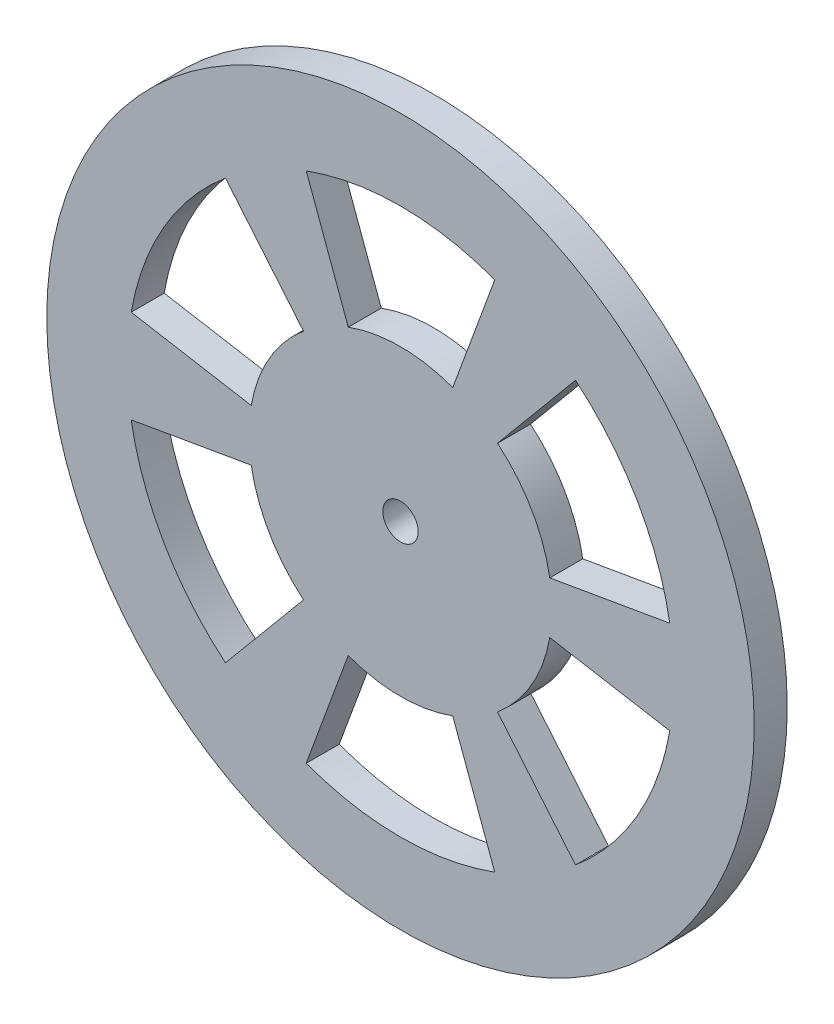
ISO-10303-21;
HEADER;
FILE_DESCRIPTION(('STEP AP214'),'2;1');
FILE_NAME('part.step','',(''),(''),'','','');
FILE_SCHEMA(('AUTOMOTIVE_DESIGN { 1 0 10303 214 1 1 1 1 }'));
ENDSEC;
DATA;
#1=APPLICATION_CONTEXT('core data for automotive mechanical design processes');
#2=APPLICATION_PROTOCOL_DEFINITION('international standard','automotive_design',2000,#1);
#3=PRODUCT_CONTEXT('',#1,'mechanical');
#4=PRODUCT('Part','Part','',(#3));
#5=PRODUCT_RELATED_PRODUCT_CATEGORY('part','',(#4));
#6=PRODUCT_DEFINITION_FORMATION('','',#4);
#7=PRODUCT_DEFINITION_CONTEXT('part definition',#1,'design');
#8=PRODUCT_DEFINITION('design','',#6,#7);
#9=PRODUCT_DEFINITION_SHAPE('','',#8);
#10=(LENGTH_UNIT() NAMED_UNIT(*) SI_UNIT(.MILLI.,.METRE.));
#11=(NAMED_UNIT(*) PLANE_ANGLE_UNIT() SI_UNIT($,.RADIAN.));
#12=(NAMED_UNIT(*) SI_UNIT($,.STERADIAN.) SOLID_ANGLE_UNIT());
#13=UNCERTAINTY_MEASURE_WITH_UNIT(LENGTH_MEASURE(1.E-05),#10,'distance_accuracy_value','');
#14=(GEOMETRIC_REPRESENTATION_CONTEXT(3) GLOBAL_UNCERTAINTY_ASSIGNED_CONTEXT((#13)) GLOBAL_UNIT_ASSIGNED_CONTEXT((#10,
#11,#12)) REPRESENTATION_CONTEXT('',''));
#15=CARTESIAN_POINT('',(0.,0.,0.));
#16=DIRECTION('',(0.,0.,1.));
#17=DIRECTION('',(1.,0.,0.));
#18=AXIS2_PLACEMENT_3D('',#15,#16,#17);
#19=CARTESIAN_POINT('',(183.021792722612,1.63874984873974,2.8));
#20=DIRECTION('',(0.,0.,1.));
#21=DIRECTION('',(1.,0.,0.));
#22=AXIS2_PLACEMENT_3D('',#19,#20,#21);
#23=PLANE('',#22);
#24=CARTESIAN_POINT('',(183.021792722612,1.63874984873974,2.8));
#25=DIRECTION('',(0.,0.,1.));
#26=DIRECTION('',(1.,0.,0.));
#27=AXIS2_PLACEMENT_3D('',#24,#25,#26);
#28=CIRCLE('',#27,30.);
#29=CARTESIAN_POINT('',(213.021792722612,1.63874984873974,2.8));
#30=VERTEX_POINT('',#29);
#31=EDGE_CURVE('E11',#30,#30,#28,.T.);
#32=ORIENTED_EDGE('',*,*,#31,.T.);
#33=EDGE_LOOP('',(#32));
#34=FACE_BOUND('',#33,.T.);
#35=CARTESIAN_POINT('',(183.021792722612,1.63874984873974,2.8));
#36=DIRECTION('',(0.,0.,1.));
#37=DIRECTION('',(1.,0.,0.));
#38=AXIS2_PLACEMENT_3D('',#35,#36,#37);
#39=CIRCLE('',#38,1.5);
#40=CARTESIAN_POINT('',(184.521792722612,1.63874984873974,2.8));
#41=VERTEX_POINT('',#40);
#42=EDGE_CURVE('E464',#41,#41,#39,.T.);
#43=ORIENTED_EDGE('',*,*,#42,.F.);
#44=EDGE_LOOP('',(#43));
#45=FACE_BOUND('',#44,.T.);
#46=DIRECTION('',(-0.985365515869282,-0.170454686458493,0.));
#47=VECTOR('',#46,1.);
#48=CARTESIAN_POINT('',(160.183368766663,-2.31198349023178,2.8));
#49=LINE('',#48,#47);
#50=CARTESIAN_POINT('',(170.361444544406,-0.551316319009075,2.8));
#51=VERTEX_POINT('',#50);
#52=CARTESIAN_POINT('',(160.183368766663,-2.31198349023178,2.8));
#53=VERTEX_POINT('',#52);
#54=EDGE_CURVE('E424',#51,#53,#49,.T.);
#55=ORIENTED_EDGE('',*,*,#54,.F.);
#56=CARTESIAN_POINT('',(183.021792722612,1.63874984873974,2.8));
#57=DIRECTION('',(0.,0.,-1.));
#58=DIRECTION('',(1.,0.,0.));
#59=AXIS2_PLACEMENT_3D('',#56,#57,#58);
#60=CIRCLE('',#59,12.8483775556502);
#61=CARTESIAN_POINT('',(174.792614703204,-8.22843997093123,2.8));
#62=VERTEX_POINT('',#61);
#63=EDGE_CURVE('E421',#62,#51,#60,.T.);
#64=ORIENTED_EDGE('',*,*,#63,.F.);
#65=DIRECTION('',(0.640483826363731,0.767971658439603,0.));
#66=VECTOR('',#65,1.);
#67=CARTESIAN_POINT('',(168.176904274776,-16.1610026686035,2.8));
#68=LINE('',#67,#66);
#69=CARTESIAN_POINT('',(168.176904274776,-16.1610026686035,2.8));
#70=VERTEX_POINT('',#69);
#71=EDGE_CURVE('E432',#70,#62,#68,.T.);
#72=ORIENTED_EDGE('',*,*,#71,.F.);
#73=CARTESIAN_POINT('',(183.021792722612,1.63874984873974,2.8));
#74=DIRECTION('',(0.,0.,1.));
#75=DIRECTION('',(1.,0.,0.));
#76=AXIS2_PLACEMENT_3D('',#73,#74,#75);
#77=CIRCLE('',#76,23.1776164155711);
#78=EDGE_CURVE('E428',#53,#70,#77,.T.);
#79=ORIENTED_EDGE('',*,*,#78,.F.);
#80=EDGE_LOOP('',(#55,#64,#72,#79));
#81=FACE_BOUND('',#80,.T.);
#82=DIRECTION('',(-0.345064669267472,-0.938578911985204,0.));
#83=VECTOR('',#82,1.);
#84=CARTESIAN_POINT('',(175.024016179765,-20.1152721489974,2.8));
#85=LINE('',#84,#83);
#86=CARTESIAN_POINT('',(178.588271570748,-10.4204663782176,2.8));
#87=VERTEX_POINT('',#86);
#88=CARTESIAN_POINT('',(175.024016179765,-20.1152721489974,2.8));
#89=VERTEX_POINT('',#88);
#90=EDGE_CURVE('E381',#87,#89,#85,.T.);
#91=ORIENTED_EDGE('',*,*,#90,.F.);
#92=CARTESIAN_POINT('',(183.021792722612,1.63874984873974,2.8));
#93=DIRECTION('',(0.,0.,-1.));
#94=DIRECTION('',(1.,0.,0.));
#95=AXIS2_PLACEMENT_3D('',#92,#93,#94);
#96=CIRCLE('',#95,12.8483775556503);
#97=CARTESIAN_POINT('',(187.452440760706,-10.4215222781683,2.8));
#98=VERTEX_POINT('',#97);
#99=EDGE_CURVE('E378',#98,#87,#96,.T.);
#100=ORIENTED_EDGE('',*,*,#99,.F.);
#101=DIRECTION('',(-0.344841052413296,0.938661093563854,0.));
#102=VECTOR('',#101,1.);
#103=CARTESIAN_POINT('',(191.01438635979,-20.1171769221038,2.8));
#104=LINE('',#103,#102);
#105=CARTESIAN_POINT('',(191.01438635979,-20.1171769221038,2.8));
#106=VERTEX_POINT('',#105);
#107=EDGE_CURVE('E389',#106,#98,#104,.T.);
#108=ORIENTED_EDGE('',*,*,#107,.F.);
#109=CARTESIAN_POINT('',(183.021792722612,1.63874984873974,2.8));
#110=DIRECTION('',(0.,0.,1.));
#111=DIRECTION('',(1.,0.,0.));
#112=AXIS2_PLACEMENT_3D('',#109,#110,#111);
#113=CIRCLE('',#112,23.1776164155711);
#114=EDGE_CURVE('E385',#89,#106,#113,.T.);
#115=ORIENTED_EDGE('',*,*,#114,.F.);
#116=EDGE_LOOP('',(#91,#100,#108,#115));
#117=FACE_BOUND('',#116,.T.);
#118=DIRECTION('',(0.985324878777029,-0.170689435124245,0.));
#119=VECTOR('',#118,1.);
#120=CARTESIAN_POINT('',(160.184310637599,5.59492410224006,2.8));
#121=LINE('',#120,#119);
#122=CARTESIAN_POINT('',(160.184310637599,5.59492410224006,2.8));
#123=VERTEX_POINT('',#122);
#124=CARTESIAN_POINT('',(170.36196666511,3.83183215597675,2.8));
#125=VERTEX_POINT('',#124);
#126=EDGE_CURVE('E338',#123,#125,#121,.T.);
#127=ORIENTED_EDGE('',*,*,#126,.F.);
#128=CARTESIAN_POINT('',(183.021792722612,1.63874984873974,2.8));
#129=DIRECTION('',(0.,0.,1.));
#130=DIRECTION('',(1.,0.,0.));
#131=AXIS2_PLACEMENT_3D('',#128,#129,#130);
#132=CIRCLE('',#131,23.1776164155711);
#133=CARTESIAN_POINT('',(168.18114530951,19.4420385075054,2.8));
#134=VERTEX_POINT('',#133);
#135=EDGE_CURVE('E335',#134,#123,#132,.T.);
#136=ORIENTED_EDGE('',*,*,#135,.F.);
#137=DIRECTION('',(-0.640300846601809,0.768124225526709,0.));
#138=VECTOR('',#137,1.);
#139=CARTESIAN_POINT('',(168.18114530951,19.4420385075054,2.8));
#140=LINE('',#139,#138);
#141=CARTESIAN_POINT('',(174.79496569627,11.5078999079482,2.8));
#142=VERTEX_POINT('',#141);
#143=EDGE_CURVE('E346',#142,#134,#140,.T.);
#144=ORIENTED_EDGE('',*,*,#143,.F.);
#145=CARTESIAN_POINT('',(183.021792722612,1.63874984873974,2.8));
#146=DIRECTION('',(0.,0.,-1.));
#147=DIRECTION('',(1.,0.,0.));
#148=AXIS2_PLACEMENT_3D('',#145,#146,#147);
#149=CIRCLE('',#148,12.8483775556502);
#150=EDGE_CURVE('E342',#125,#142,#149,.T.);
#151=ORIENTED_EDGE('',*,*,#150,.F.);
#152=EDGE_LOOP('',(#127,#136,#144,#151));
#153=FACE_BOUND('',#152,.T.);
#154=DIRECTION('',(0.640300846601808,-0.76812422552671,0.));
#155=VECTOR('',#154,1.);
#156=CARTESIAN_POINT('',(197.862440135714,-16.1645388100259,2.8));
#157=LINE('',#156,#155);
#158=CARTESIAN_POINT('',(191.248619748955,-8.23040021046873,2.8));
#159=VERTEX_POINT('',#158);
#160=CARTESIAN_POINT('',(197.862440135714,-16.1645388100259,2.8));
#161=VERTEX_POINT('',#160);
#162=EDGE_CURVE('E295',#159,#161,#157,.T.);
#163=ORIENTED_EDGE('',*,*,#162,.F.);
#164=CARTESIAN_POINT('',(183.021792722612,1.63874984873974,2.8));
#165=DIRECTION('',(0.,0.,-1.));
#166=DIRECTION('',(1.,0.,0.));
#167=AXIS2_PLACEMENT_3D('',#164,#165,#166);
#168=CIRCLE('',#167,12.8483775556502);
#169=CARTESIAN_POINT('',(195.681618780115,-0.554332458497256,2.8));
#170=VERTEX_POINT('',#169);
#171=EDGE_CURVE('E292',#170,#159,#168,.T.);
#172=ORIENTED_EDGE('',*,*,#171,.F.);
#173=DIRECTION('',(-0.985324878777028,0.170689435124247,0.));
#174=VECTOR('',#173,1.);
#175=CARTESIAN_POINT('',(205.859274807625,-2.31742440476058,2.8));
#176=LINE('',#175,#174);
#177=CARTESIAN_POINT('',(205.859274807625,-2.31742440476059,2.8));
#178=VERTEX_POINT('',#177);
#179=EDGE_CURVE('E303',#178,#170,#176,.T.);
#180=ORIENTED_EDGE('',*,*,#179,.F.);
#181=CARTESIAN_POINT('',(183.021792722612,1.63874984873974,2.8));
#182=DIRECTION('',(0.,0.,1.));
#183=DIRECTION('',(1.,0.,0.));
#184=AXIS2_PLACEMENT_3D('',#181,#182,#183);
#185=CIRCLE('',#184,23.1776164155711);
#186=EDGE_CURVE('E299',#161,#178,#185,.T.);
#187=ORIENTED_EDGE('',*,*,#186,.F.);
#188=EDGE_LOOP('',(#163,#172,#180,#187));
#189=FACE_BOUND('',#188,.T.);
#190=DIRECTION('',(-0.640483826363731,-0.767971658439603,0.));
#191=VECTOR('',#190,1.);
#192=CARTESIAN_POINT('',(197.866681170448,19.4385023660829,2.8));
#193=LINE('',#192,#191);
#194=CARTESIAN_POINT('',(197.866681170448,19.4385023660829,2.8));
#195=VERTEX_POINT('',#194);
#196=CARTESIAN_POINT('',(191.250970742021,11.5059396684107,2.8));
#197=VERTEX_POINT('',#196);
#198=EDGE_CURVE('E252',#195,#197,#193,.T.);
#199=ORIENTED_EDGE('',*,*,#198,.F.);
#200=CARTESIAN_POINT('',(183.021792722612,1.63874984873974,2.8));
#201=DIRECTION('',(0.,0.,1.));
#202=DIRECTION('',(1.,0.,0.));
#203=AXIS2_PLACEMENT_3D('',#200,#201,#202);
#204=CIRCLE('',#203,23.1776164155711);
#205=CARTESIAN_POINT('',(205.860216678562,5.58948318771124,2.8));
#206=VERTEX_POINT('',#205);
#207=EDGE_CURVE('E249',#206,#195,#204,.T.);
#208=ORIENTED_EDGE('',*,*,#207,.F.);
#209=DIRECTION('',(0.985365515869282,0.170454686458493,0.));
#210=VECTOR('',#209,1.);
#211=CARTESIAN_POINT('',(205.860216678562,5.58948318771124,2.8));
#212=LINE('',#211,#210);
#213=CARTESIAN_POINT('',(195.682140900819,3.82881601648853,2.8));
#214=VERTEX_POINT('',#213);
#215=EDGE_CURVE('E260',#214,#206,#212,.T.);
#216=ORIENTED_EDGE('',*,*,#215,.F.);
#217=CARTESIAN_POINT('',(183.021792722612,1.63874984873974,2.8));
#218=DIRECTION('',(0.,0.,-1.));
#219=DIRECTION('',(1.,0.,0.));
#220=AXIS2_PLACEMENT_3D('',#217,#218,#219);
#221=CIRCLE('',#220,12.8483775556502);
#222=EDGE_CURVE('E256',#197,#214,#221,.T.);
#223=ORIENTED_EDGE('',*,*,#222,.F.);
#224=EDGE_LOOP('',(#199,#208,#216,#223));
#225=FACE_BOUND('',#224,.T.);
#226=DIRECTION('',(0.344841052413296,-0.938661093563854,0.));
#227=VECTOR('',#226,1.);
#228=CARTESIAN_POINT('',(175.029199085435,23.3946766195833,2.8));
#229=LINE('',#228,#227);
#230=CARTESIAN_POINT('',(175.029199085435,23.3946766195833,2.8));
#231=VERTEX_POINT('',#230);
#232=CARTESIAN_POINT('',(178.591144684518,13.6990219756476,2.8));
#233=VERTEX_POINT('',#232);
#234=EDGE_CURVE('E210',#231,#233,#229,.T.);
#235=ORIENTED_EDGE('',*,*,#234,.F.);
#236=CARTESIAN_POINT('',(183.021792722612,1.63874984873974,2.8));
#237=DIRECTION('',(0.,0.,1.));
#238=DIRECTION('',(1.,0.,0.));
#239=AXIS2_PLACEMENT_3D('',#236,#237,#238);
#240=CIRCLE('',#239,23.1776164155711);
#241=CARTESIAN_POINT('',(191.019569265459,23.3927718464769,2.8));
#242=VERTEX_POINT('',#241);
#243=EDGE_CURVE('E201',#242,#231,#240,.T.);
#244=ORIENTED_EDGE('',*,*,#243,.F.);
#245=DIRECTION('',(0.345064669267472,0.938578911985204,0.));
#246=VECTOR('',#245,1.);
#247=CARTESIAN_POINT('',(191.019569265459,23.3927718464769,2.8));
#248=LINE('',#247,#246);
#249=CARTESIAN_POINT('',(187.455313874476,13.697966075697,2.8));
#250=VERTEX_POINT('',#249);
#251=EDGE_CURVE('E227',#250,#242,#248,.T.);
#252=ORIENTED_EDGE('',*,*,#251,.F.);
#253=CARTESIAN_POINT('',(183.021792722612,1.63874984873974,2.8));
#254=DIRECTION('',(0.,0.,-1.));
#255=DIRECTION('',(1.,0.,0.));
#256=AXIS2_PLACEMENT_3D('',#253,#254,#255);
#257=CIRCLE('',#256,12.8483775556503);
#258=EDGE_CURVE('E223',#233,#250,#257,.T.);
#259=ORIENTED_EDGE('',*,*,#258,.F.);
#260=EDGE_LOOP('',(#235,#244,#252,#259));
#261=FACE_BOUND('',#260,.T.);
#262=ADVANCED_FACE('F39',(#34,#45,#81,#117,#153,#189,#225,#261),#23,.T.);
#263=CARTESIAN_POINT('',(183.021792722612,1.63874984873974,0.));
#264=DIRECTION('',(0.,0.,1.));
#265=DIRECTION('',(1.,0.,0.));
#266=AXIS2_PLACEMENT_3D('',#263,#264,#265);
#267=PLANE('',#266);
#268=CARTESIAN_POINT('',(183.021792722612,1.63874984873974,0.));
#269=DIRECTION('',(0.,0.,1.));
#270=DIRECTION('',(1.,0.,0.));
#271=AXIS2_PLACEMENT_3D('',#268,#269,#270);
#272=CIRCLE('',#271,23.1776164155711);
#273=CARTESIAN_POINT('',(205.860216678562,5.58948318771124,0.));
#274=VERTEX_POINT('',#273);
#275=CARTESIAN_POINT('',(197.866681170448,19.4385023660829,0.));
#276=VERTEX_POINT('',#275);
#277=EDGE_CURVE('E219',#274,#276,#272,.T.);
#278=ORIENTED_EDGE('',*,*,#277,.T.);
#279=DIRECTION('',(-0.640483826363731,-0.767971658439603,0.));
#280=VECTOR('',#279,1.);
#281=CARTESIAN_POINT('',(197.866681170448,19.4385023660829,0.));
#282=LINE('',#281,#280);
#283=CARTESIAN_POINT('',(191.250970742021,11.5059396684107,0.));
#284=VERTEX_POINT('',#283);
#285=EDGE_CURVE('E267',#276,#284,#282,.T.);
#286=ORIENTED_EDGE('',*,*,#285,.T.);
#287=CARTESIAN_POINT('',(183.021792722612,1.63874984873974,0.));
#288=DIRECTION('',(0.,0.,-1.));
#289=DIRECTION('',(1.,0.,0.));
#290=AXIS2_PLACEMENT_3D('',#287,#288,#289);
#291=CIRCLE('',#290,12.8483775556502);
#292=CARTESIAN_POINT('',(195.682140900819,3.82881601648853,0.));
#293=VERTEX_POINT('',#292);
#294=EDGE_CURVE('E271',#284,#293,#291,.T.);
#295=ORIENTED_EDGE('',*,*,#294,.T.);
#296=DIRECTION('',(0.985365515869282,0.170454686458493,0.));
#297=VECTOR('',#296,1.);
#298=CARTESIAN_POINT('',(205.860216678562,5.58948318771124,0.));
#299=LINE('',#298,#297);
#300=EDGE_CURVE('E253',#293,#274,#299,.T.);
#301=ORIENTED_EDGE('',*,*,#300,.T.);
#302=EDGE_LOOP('',(#278,#286,#295,#301));
#303=FACE_BOUND('',#302,.T.);
#304=CARTESIAN_POINT('',(183.021792722612,1.63874984873974,0.));
#305=DIRECTION('',(0.,0.,1.));
#306=DIRECTION('',(1.,0.,0.));
#307=AXIS2_PLACEMENT_3D('',#304,#305,#306);
#308=CIRCLE('',#307,23.1776164155711);
#309=CARTESIAN_POINT('',(168.18114530951,19.4420385075054,0.));
#310=VERTEX_POINT('',#309);
#311=CARTESIAN_POINT('',(160.184310637599,5.59492410224006,0.));
#312=VERTEX_POINT('',#311);
#313=EDGE_CURVE('E334',#310,#312,#308,.T.);
#314=ORIENTED_EDGE('',*,*,#313,.T.);
#315=DIRECTION('',(0.985324878777029,-0.170689435124245,0.));
#316=VECTOR('',#315,1.);
#317=CARTESIAN_POINT('',(160.184310637599,5.59492410224006,0.));
#318=LINE('',#317,#316);
#319=CARTESIAN_POINT('',(170.36196666511,3.83183215597675,0.));
#320=VERTEX_POINT('',#319);
#321=EDGE_CURVE('E353',#312,#320,#318,.T.);
#322=ORIENTED_EDGE('',*,*,#321,.T.);
#323=CARTESIAN_POINT('',(183.021792722612,1.63874984873974,0.));
#324=DIRECTION('',(0.,0.,-1.));
#325=DIRECTION('',(1.,0.,0.));
#326=AXIS2_PLACEMENT_3D('',#323,#324,#325);
#327=CIRCLE('',#326,12.8483775556502);
#328=CARTESIAN_POINT('',(174.79496569627,11.5078999079482,0.));
#329=VERTEX_POINT('',#328);
#330=EDGE_CURVE('E357',#320,#329,#327,.T.);
#331=ORIENTED_EDGE('',*,*,#330,.T.);
#332=DIRECTION('',(-0.640300846601809,0.768124225526709,0.));
#333=VECTOR('',#332,1.);
#334=CARTESIAN_POINT('',(168.18114530951,19.4420385075054,0.));
#335=LINE('',#334,#333);
#336=EDGE_CURVE('E339',#329,#310,#335,.T.);
#337=ORIENTED_EDGE('',*,*,#336,.T.);
#338=EDGE_LOOP('',(#314,#322,#331,#337));
#339=FACE_BOUND('',#338,.T.);
#340=CARTESIAN_POINT('',(183.021792722612,1.63874984873974,0.));
#341=DIRECTION('',(0.,0.,-1.));
#342=DIRECTION('',(1.,0.,0.));
#343=AXIS2_PLACEMENT_3D('',#340,#341,#342);
#344=CIRCLE('',#343,12.8483775556502);
#345=CARTESIAN_POINT('',(174.792614703204,-8.22843997093123,0.));
#346=VERTEX_POINT('',#345);
#347=CARTESIAN_POINT('',(170.361444544406,-0.551316319009075,0.));
#348=VERTEX_POINT('',#347);
#349=EDGE_CURVE('E420',#346,#348,#344,.T.);
#350=ORIENTED_EDGE('',*,*,#349,.T.);
#351=DIRECTION('',(-0.985365515869282,-0.170454686458493,0.));
#352=VECTOR('',#351,1.);
#353=CARTESIAN_POINT('',(160.183368766663,-2.31198349023178,0.));
#354=LINE('',#353,#352);
#355=CARTESIAN_POINT('',(160.183368766663,-2.31198349023178,0.));
#356=VERTEX_POINT('',#355);
#357=EDGE_CURVE('E439',#348,#356,#354,.T.);
#358=ORIENTED_EDGE('',*,*,#357,.T.);
#359=CARTESIAN_POINT('',(183.021792722612,1.63874984873974,0.));
#360=DIRECTION('',(0.,0.,1.));
#361=DIRECTION('',(1.,0.,0.));
#362=AXIS2_PLACEMENT_3D('',#359,#360,#361);
#363=CIRCLE('',#362,23.1776164155711);
#364=CARTESIAN_POINT('',(168.176904274776,-16.1610026686035,0.));
#365=VERTEX_POINT('',#364);
#366=EDGE_CURVE('E443',#356,#365,#363,.T.);
#367=ORIENTED_EDGE('',*,*,#366,.T.);
#368=DIRECTION('',(0.640483826363731,0.767971658439603,0.));
#369=VECTOR('',#368,1.);
#370=CARTESIAN_POINT('',(168.176904274776,-16.1610026686035,0.));
#371=LINE('',#370,#369);
#372=EDGE_CURVE('E425',#365,#346,#371,.T.);
#373=ORIENTED_EDGE('',*,*,#372,.T.);
#374=EDGE_LOOP('',(#350,#358,#367,#373));
#375=FACE_BOUND('',#374,.T.);
#376=CARTESIAN_POINT('',(183.021792722612,1.63874984873974,0.));
#377=DIRECTION('',(0.,0.,1.));
#378=DIRECTION('',(1.,0.,0.));
#379=AXIS2_PLACEMENT_3D('',#376,#377,#378);
#380=CIRCLE('',#379,30.);
#381=CARTESIAN_POINT('',(213.021792722612,1.63874984873974,0.));
#382=VERTEX_POINT('',#381);
#383=EDGE_CURVE('E43',#382,#382,#380,.T.);
#384=ORIENTED_EDGE('',*,*,#383,.F.);
#385=EDGE_LOOP('',(#384));
#386=FACE_BOUND('',#385,.T.);
#387=CARTESIAN_POINT('',(183.021792722612,1.63874984873974,0.));
#388=DIRECTION('',(0.,0.,1.));
#389=DIRECTION('',(1.,0.,0.));
#390=AXIS2_PLACEMENT_3D('',#387,#388,#389);
#391=CIRCLE('',#390,1.5);
#392=CARTESIAN_POINT('',(184.521792722612,1.63874984873974,0.));
#393=VERTEX_POINT('',#392);
#394=EDGE_CURVE('E463',#393,#393,#391,.T.);
#395=ORIENTED_EDGE('',*,*,#394,.T.);
#396=EDGE_LOOP('',(#395));
#397=FACE_BOUND('',#396,.T.);
#398=CARTESIAN_POINT('',(183.021792722612,1.63874984873974,0.));
#399=DIRECTION('',(0.,0.,-1.));
#400=DIRECTION('',(1.,0.,0.));
#401=AXIS2_PLACEMENT_3D('',#398,#399,#400);
#402=CIRCLE('',#401,12.8483775556503);
#403=CARTESIAN_POINT('',(187.452440760706,-10.4215222781683,0.));
#404=VERTEX_POINT('',#403);
#405=CARTESIAN_POINT('',(178.588271570748,-10.4204663782176,0.));
#406=VERTEX_POINT('',#405);
#407=EDGE_CURVE('E377',#404,#406,#402,.T.);
#408=ORIENTED_EDGE('',*,*,#407,.T.);
#409=DIRECTION('',(-0.345064669267472,-0.938578911985204,0.));
#410=VECTOR('',#409,1.);
#411=CARTESIAN_POINT('',(175.024016179765,-20.1152721489974,0.));
#412=LINE('',#411,#410);
#413=CARTESIAN_POINT('',(175.024016179765,-20.1152721489974,0.));
#414=VERTEX_POINT('',#413);
#415=EDGE_CURVE('E396',#406,#414,#412,.T.);
#416=ORIENTED_EDGE('',*,*,#415,.T.);
#417=CARTESIAN_POINT('',(183.021792722612,1.63874984873974,0.));
#418=DIRECTION('',(0.,0.,1.));
#419=DIRECTION('',(1.,0.,0.));
#420=AXIS2_PLACEMENT_3D('',#417,#418,#419);
#421=CIRCLE('',#420,23.1776164155711);
#422=CARTESIAN_POINT('',(191.01438635979,-20.1171769221038,0.));
#423=VERTEX_POINT('',#422);
#424=EDGE_CURVE('E400',#414,#423,#421,.T.);
#425=ORIENTED_EDGE('',*,*,#424,.T.);
#426=DIRECTION('',(-0.344841052413296,0.938661093563854,0.));
#427=VECTOR('',#426,1.);
#428=CARTESIAN_POINT('',(191.01438635979,-20.1171769221038,0.));
#429=LINE('',#428,#427);
#430=EDGE_CURVE('E382',#423,#404,#429,.T.);
#431=ORIENTED_EDGE('',*,*,#430,.T.);
#432=EDGE_LOOP('',(#408,#416,#425,#431));
#433=FACE_BOUND('',#432,.T.);
#434=CARTESIAN_POINT('',(183.021792722612,1.63874984873974,0.));
#435=DIRECTION('',(0.,0.,-1.));
#436=DIRECTION('',(1.,0.,0.));
#437=AXIS2_PLACEMENT_3D('',#434,#435,#436);
#438=CIRCLE('',#437,12.8483775556502);
#439=CARTESIAN_POINT('',(195.681618780115,-0.554332458497256,0.));
#440=VERTEX_POINT('',#439);
#441=CARTESIAN_POINT('',(191.248619748955,-8.23040021046873,0.));
#442=VERTEX_POINT('',#441);
#443=EDGE_CURVE('E291',#440,#442,#438,.T.);
#444=ORIENTED_EDGE('',*,*,#443,.T.);
#445=DIRECTION('',(0.640300846601808,-0.76812422552671,0.));
#446=VECTOR('',#445,1.);
#447=CARTESIAN_POINT('',(197.862440135714,-16.1645388100259,0.));
#448=LINE('',#447,#446);
#449=CARTESIAN_POINT('',(197.862440135714,-16.1645388100259,0.));
#450=VERTEX_POINT('',#449);
#451=EDGE_CURVE('E310',#442,#450,#448,.T.);
#452=ORIENTED_EDGE('',*,*,#451,.T.);
#453=CARTESIAN_POINT('',(183.021792722612,1.63874984873974,0.));
#454=DIRECTION('',(0.,0.,1.));
#455=DIRECTION('',(1.,0.,0.));
#456=AXIS2_PLACEMENT_3D('',#453,#454,#455);
#457=CIRCLE('',#456,23.1776164155711);
#458=CARTESIAN_POINT('',(205.859274807625,-2.3174244047606,0.));
#459=VERTEX_POINT('',#458);
#460=EDGE_CURVE('E314',#450,#459,#457,.T.);
#461=ORIENTED_EDGE('',*,*,#460,.T.);
#462=DIRECTION('',(-0.985324878777028,0.170689435124247,0.));
#463=VECTOR('',#462,1.);
#464=CARTESIAN_POINT('',(205.859274807625,-2.31742440476058,0.));
#465=LINE('',#464,#463);
#466=EDGE_CURVE('E296',#459,#440,#465,.T.);
#467=ORIENTED_EDGE('',*,*,#466,.T.);
#468=EDGE_LOOP('',(#444,#452,#461,#467));
#469=FACE_BOUND('',#468,.T.);
#470=CARTESIAN_POINT('',(183.021792722612,1.63874984873974,0.));
#471=DIRECTION('',(0.,0.,1.));
#472=DIRECTION('',(1.,0.,0.));
#473=AXIS2_PLACEMENT_3D('',#470,#471,#472);
#474=CIRCLE('',#473,23.1776164155711);
#475=CARTESIAN_POINT('',(191.019569265459,23.3927718464769,0.));
#476=VERTEX_POINT('',#475);
#477=CARTESIAN_POINT('',(175.029199085435,23.3946766195833,0.));
#478=VERTEX_POINT('',#477);
#479=EDGE_CURVE('E63',#476,#478,#474,.T.);
#480=ORIENTED_EDGE('',*,*,#479,.T.);
#481=DIRECTION('',(0.344841052413296,-0.938661093563854,0.));
#482=VECTOR('',#481,1.);
#483=CARTESIAN_POINT('',(175.029199085435,23.3946766195833,0.));
#484=LINE('',#483,#482);
#485=CARTESIAN_POINT('',(178.591144684518,13.6990219756476,0.));
#486=VERTEX_POINT('',#485);
#487=EDGE_CURVE('E217',#478,#486,#484,.T.);
#488=ORIENTED_EDGE('',*,*,#487,.T.);
#489=CARTESIAN_POINT('',(183.021792722612,1.63874984873974,0.));
#490=DIRECTION('',(0.,0.,-1.));
#491=DIRECTION('',(1.,0.,0.));
#492=AXIS2_PLACEMENT_3D('',#489,#490,#491);
#493=CIRCLE('',#492,12.8483775556503);
#494=CARTESIAN_POINT('',(187.455313874476,13.697966075697,0.));
#495=VERTEX_POINT('',#494);
#496=EDGE_CURVE('E236',#486,#495,#493,.T.);
#497=ORIENTED_EDGE('',*,*,#496,.T.);
#498=DIRECTION('',(0.345064669267472,0.938578911985204,0.));
#499=VECTOR('',#498,1.);
#500=CARTESIAN_POINT('',(191.019569265459,23.3927718464769,0.));
#501=LINE('',#500,#499);
#502=EDGE_CURVE('E211',#495,#476,#501,.T.);
#503=ORIENTED_EDGE('',*,*,#502,.T.);
#504=EDGE_LOOP('',(#480,#488,#497,#503));
#505=FACE_BOUND('',#504,.T.);
#506=ADVANCED_FACE('F472',(#303,#339,#375,#386,#397,#433,#469,#505),#267,.F.);
#507=CARTESIAN_POINT('',(183.021792722612,1.63874984873974,2.8));
#508=DIRECTION('',(0.,0.,-1.));
#509=DIRECTION('',(-1.,0.,0.));
#510=AXIS2_PLACEMENT_3D('',#507,#508,#509);
#511=CYLINDRICAL_SURFACE('',#510,30.);
#512=ORIENTED_EDGE('',*,*,#31,.F.);
#513=EDGE_LOOP('',(#512));
#514=FACE_BOUND('',#513,.T.);
#515=ORIENTED_EDGE('',*,*,#383,.T.);
#516=EDGE_LOOP('',(#515));
#517=FACE_BOUND('',#516,.T.);
#518=ADVANCED_FACE('F41',(#514,#517),#511,.T.);
#519=CARTESIAN_POINT('',(183.021792722612,1.63874984873974,2.8));
#520=DIRECTION('',(0.,0.,-1.));
#521=DIRECTION('',(-1.,0.,0.));
#522=AXIS2_PLACEMENT_3D('',#519,#520,#521);
#523=CYLINDRICAL_SURFACE('',#522,1.5);
#524=ORIENTED_EDGE('',*,*,#42,.T.);
#525=EDGE_LOOP('',(#524));
#526=FACE_BOUND('',#525,.T.);
#527=ORIENTED_EDGE('',*,*,#394,.F.);
#528=EDGE_LOOP('',(#527));
#529=FACE_BOUND('',#528,.T.);
#530=ADVANCED_FACE('F475',(#526,#529),#523,.F.);
#531=CARTESIAN_POINT('',(183.021792722612,1.63874984873974,2.8));
#532=DIRECTION('',(0.,0.,-1.));
#533=DIRECTION('',(-1.,0.,0.));
#534=AXIS2_PLACEMENT_3D('',#531,#532,#533);
#535=CYLINDRICAL_SURFACE('',#534,12.8483775556502);
#536=ORIENTED_EDGE('',*,*,#349,.F.);
#537=DIRECTION('',(0.,0.,-1.));
#538=VECTOR('',#537,1.);
#539=CARTESIAN_POINT('',(174.792614703204,-8.22843997093123,2.8));
#540=LINE('',#539,#538);
#541=EDGE_CURVE('E435',#62,#346,#540,.T.);
#542=ORIENTED_EDGE('',*,*,#541,.F.);
#543=ORIENTED_EDGE('',*,*,#63,.T.);
#544=DIRECTION('',(0.,0.,-1.));
#545=VECTOR('',#544,1.);
#546=CARTESIAN_POINT('',(170.361444544406,-0.551316319009075,2.8));
#547=LINE('',#546,#545);
#548=EDGE_CURVE('E459',#51,#348,#547,.T.);
#549=ORIENTED_EDGE('',*,*,#548,.T.);
#550=EDGE_LOOP('',(#536,#542,#543,#549));
#551=FACE_BOUND('',#550,.T.);
#552=ADVANCED_FACE('F477',(#551),#535,.T.);
#553=CARTESIAN_POINT('',(160.183368766663,-2.31198349023178,2.8));
#554=DIRECTION('',(0.170454686458493,-0.985365515869282,0.));
#555=DIRECTION('',(0.985365515869282,0.170454686458493,0.));
#556=AXIS2_PLACEMENT_3D('',#553,#554,#555);
#557=PLANE('',#556);
#558=ORIENTED_EDGE('',*,*,#357,.F.);
#559=ORIENTED_EDGE('',*,*,#548,.F.);
#560=ORIENTED_EDGE('',*,*,#54,.T.);
#561=DIRECTION('',(0.,0.,-1.));
#562=VECTOR('',#561,1.);
#563=CARTESIAN_POINT('',(160.183368766663,-2.31198349023178,2.8));
#564=LINE('',#563,#562);
#565=EDGE_CURVE('E456',#53,#356,#564,.T.);
#566=ORIENTED_EDGE('',*,*,#565,.T.);
#567=EDGE_LOOP('',(#558,#559,#560,#566));
#568=FACE_BOUND('',#567,.T.);
#569=ADVANCED_FACE('F484',(#568),#557,.T.);
#570=CARTESIAN_POINT('',(183.021792722612,1.63874984873974,2.8));
#571=DIRECTION('',(0.,0.,-1.));
#572=DIRECTION('',(-1.,0.,0.));
#573=AXIS2_PLACEMENT_3D('',#570,#571,#572);
#574=CYLINDRICAL_SURFACE('',#573,23.1776164155711);
#575=ORIENTED_EDGE('',*,*,#366,.F.);
#576=ORIENTED_EDGE('',*,*,#565,.F.);
#577=ORIENTED_EDGE('',*,*,#78,.T.);
#578=DIRECTION('',(0.,0.,-1.));
#579=VECTOR('',#578,1.);
#580=CARTESIAN_POINT('',(168.176904274776,-16.1610026686035,2.8));
#581=LINE('',#580,#579);
#582=EDGE_CURVE('E453',#70,#365,#581,.T.);
#583=ORIENTED_EDGE('',*,*,#582,.T.);
#584=EDGE_LOOP('',(#575,#576,#577,#583));
#585=FACE_BOUND('',#584,.T.);
#586=ADVANCED_FACE('F598',(#585),#574,.F.);
#587=CARTESIAN_POINT('',(168.176904274776,-16.1610026686035,2.8));
#588=DIRECTION('',(-0.767971658439603,0.640483826363731,0.));
#589=DIRECTION('',(-0.640483826363731,-0.767971658439603,0.));
#590=AXIS2_PLACEMENT_3D('',#587,#588,#589);
#591=PLANE('',#590);
#592=ORIENTED_EDGE('',*,*,#372,.F.);
#593=ORIENTED_EDGE('',*,*,#582,.F.);
#594=ORIENTED_EDGE('',*,*,#71,.T.);
#595=ORIENTED_EDGE('',*,*,#541,.T.);
#596=EDGE_LOOP('',(#592,#593,#594,#595));
#597=FACE_BOUND('',#596,.T.);
#598=ADVANCED_FACE('F594',(#597),#591,.T.);
#599=CARTESIAN_POINT('',(183.021792722612,1.63874984873974,2.8));
#600=DIRECTION('',(0.,0.,-1.));
#601=DIRECTION('',(-1.,0.,0.));
#602=AXIS2_PLACEMENT_3D('',#599,#600,#601);
#603=CYLINDRICAL_SURFACE('',#602,12.8483775556503);
#604=ORIENTED_EDGE('',*,*,#407,.F.);
#605=DIRECTION('',(0.,0.,-1.));
#606=VECTOR('',#605,1.);
#607=CARTESIAN_POINT('',(187.452440760706,-10.4215222781683,2.8));
#608=LINE('',#607,#606);
#609=EDGE_CURVE('E392',#98,#404,#608,.T.);
#610=ORIENTED_EDGE('',*,*,#609,.F.);
#611=ORIENTED_EDGE('',*,*,#99,.T.);
#612=DIRECTION('',(0.,0.,-1.));
#613=VECTOR('',#612,1.);
#614=CARTESIAN_POINT('',(178.588271570748,-10.4204663782176,2.8));
#615=LINE('',#614,#613);
#616=EDGE_CURVE('E416',#87,#406,#615,.T.);
#617=ORIENTED_EDGE('',*,*,#616,.T.);
#618=EDGE_LOOP('',(#604,#610,#611,#617));
#619=FACE_BOUND('',#618,.T.);
#620=ADVANCED_FACE('F590',(#619),#603,.T.);
#621=CARTESIAN_POINT('',(175.024016179765,-20.1152721489974,2.8));
#622=DIRECTION('',(0.938578911985204,-0.345064669267472,0.));
#623=DIRECTION('',(0.345064669267472,0.938578911985204,0.));
#624=AXIS2_PLACEMENT_3D('',#621,#622,#623);
#625=PLANE('',#624);
#626=ORIENTED_EDGE('',*,*,#415,.F.);
#627=ORIENTED_EDGE('',*,*,#616,.F.);
#628=ORIENTED_EDGE('',*,*,#90,.T.);
#629=DIRECTION('',(0.,0.,-1.));
#630=VECTOR('',#629,1.);
#631=CARTESIAN_POINT('',(175.024016179765,-20.1152721489974,2.8));
#632=LINE('',#631,#630);
#633=EDGE_CURVE('E413',#89,#414,#632,.T.);
#634=ORIENTED_EDGE('',*,*,#633,.T.);
#635=EDGE_LOOP('',(#626,#627,#628,#634));
#636=FACE_BOUND('',#635,.T.);
#637=ADVANCED_FACE('F586',(#636),#625,.T.);
#638=CARTESIAN_POINT('',(183.021792722612,1.63874984873974,2.8));
#639=DIRECTION('',(0.,0.,-1.));
#640=DIRECTION('',(-1.,0.,0.));
#641=AXIS2_PLACEMENT_3D('',#638,#639,#640);
#642=CYLINDRICAL_SURFACE('',#641,23.1776164155711);
#643=ORIENTED_EDGE('',*,*,#424,.F.);
#644=ORIENTED_EDGE('',*,*,#633,.F.);
#645=ORIENTED_EDGE('',*,*,#114,.T.);
#646=DIRECTION('',(0.,0.,-1.));
#647=VECTOR('',#646,1.);
#648=CARTESIAN_POINT('',(191.01438635979,-20.1171769221038,2.8));
#649=LINE('',#648,#647);
#650=EDGE_CURVE('E410',#106,#423,#649,.T.);
#651=ORIENTED_EDGE('',*,*,#650,.T.);
#652=EDGE_LOOP('',(#643,#644,#645,#651));
#653=FACE_BOUND('',#652,.T.);
#654=ADVANCED_FACE('F582',(#653),#642,.F.);
#655=CARTESIAN_POINT('',(191.01438635979,-20.1171769221038,2.8));
#656=DIRECTION('',(-0.938661093563854,-0.344841052413296,0.));
#657=DIRECTION('',(0.344841052413296,-0.938661093563854,0.));
#658=AXIS2_PLACEMENT_3D('',#655,#656,#657);
#659=PLANE('',#658);
#660=ORIENTED_EDGE('',*,*,#430,.F.);
#661=ORIENTED_EDGE('',*,*,#650,.F.);
#662=ORIENTED_EDGE('',*,*,#107,.T.);
#663=ORIENTED_EDGE('',*,*,#609,.T.);
#664=EDGE_LOOP('',(#660,#661,#662,#663));
#665=FACE_BOUND('',#664,.T.);
#666=ADVANCED_FACE('F578',(#665),#659,.T.);
#667=CARTESIAN_POINT('',(183.021792722612,1.63874984873974,2.8));
#668=DIRECTION('',(0.,0.,-1.));
#669=DIRECTION('',(-1.,0.,0.));
#670=AXIS2_PLACEMENT_3D('',#667,#668,#669);
#671=CYLINDRICAL_SURFACE('',#670,23.1776164155711);
#672=ORIENTED_EDGE('',*,*,#313,.F.);
#673=DIRECTION('',(0.,0.,-1.));
#674=VECTOR('',#673,1.);
#675=CARTESIAN_POINT('',(168.18114530951,19.4420385075054,2.8));
#676=LINE('',#675,#674);
#677=EDGE_CURVE('E349',#134,#310,#676,.T.);
#678=ORIENTED_EDGE('',*,*,#677,.F.);
#679=ORIENTED_EDGE('',*,*,#135,.T.);
#680=DIRECTION('',(0.,0.,-1.));
#681=VECTOR('',#680,1.);
#682=CARTESIAN_POINT('',(160.184310637599,5.59492410224006,2.8));
#683=LINE('',#682,#681);
#684=EDGE_CURVE('E373',#123,#312,#683,.T.);
#685=ORIENTED_EDGE('',*,*,#684,.T.);
#686=EDGE_LOOP('',(#672,#678,#679,#685));
#687=FACE_BOUND('',#686,.T.);
#688=ADVANCED_FACE('F574',(#687),#671,.F.);
#689=CARTESIAN_POINT('',(160.184310637599,5.59492410224006,2.8));
#690=DIRECTION('',(0.170689435124245,0.985324878777029,0.));
#691=DIRECTION('',(-0.985324878777029,0.170689435124245,0.));
#692=AXIS2_PLACEMENT_3D('',#689,#690,#691);
#693=PLANE('',#692);
#694=ORIENTED_EDGE('',*,*,#321,.F.);
#695=ORIENTED_EDGE('',*,*,#684,.F.);
#696=ORIENTED_EDGE('',*,*,#126,.T.);
#697=DIRECTION('',(0.,0.,-1.));
#698=VECTOR('',#697,1.);
#699=CARTESIAN_POINT('',(170.36196666511,3.83183215597675,2.8));
#700=LINE('',#699,#698);
#701=EDGE_CURVE('E370',#125,#320,#700,.T.);
#702=ORIENTED_EDGE('',*,*,#701,.T.);
#703=EDGE_LOOP('',(#694,#695,#696,#702));
#704=FACE_BOUND('',#703,.T.);
#705=ADVANCED_FACE('F570',(#704),#693,.T.);
#706=CARTESIAN_POINT('',(183.021792722612,1.63874984873974,2.8));
#707=DIRECTION('',(0.,0.,-1.));
#708=DIRECTION('',(-1.,0.,0.));
#709=AXIS2_PLACEMENT_3D('',#706,#707,#708);
#710=CYLINDRICAL_SURFACE('',#709,12.8483775556502);
#711=ORIENTED_EDGE('',*,*,#330,.F.);
#712=ORIENTED_EDGE('',*,*,#701,.F.);
#713=ORIENTED_EDGE('',*,*,#150,.T.);
#714=DIRECTION('',(0.,0.,-1.));
#715=VECTOR('',#714,1.);
#716=CARTESIAN_POINT('',(174.79496569627,11.5078999079482,2.8));
#717=LINE('',#716,#715);
#718=EDGE_CURVE('E367',#142,#329,#717,.T.);
#719=ORIENTED_EDGE('',*,*,#718,.T.);
#720=EDGE_LOOP('',(#711,#712,#713,#719));
#721=FACE_BOUND('',#720,.T.);
#722=ADVANCED_FACE('F566',(#721),#710,.T.);
#723=CARTESIAN_POINT('',(168.18114530951,19.4420385075054,2.8));
#724=DIRECTION('',(-0.768124225526709,-0.640300846601809,0.));
#725=DIRECTION('',(0.640300846601809,-0.768124225526709,0.));
#726=AXIS2_PLACEMENT_3D('',#723,#724,#725);
#727=PLANE('',#726);
#728=ORIENTED_EDGE('',*,*,#336,.F.);
#729=ORIENTED_EDGE('',*,*,#718,.F.);
#730=ORIENTED_EDGE('',*,*,#143,.T.);
#731=ORIENTED_EDGE('',*,*,#677,.T.);
#732=EDGE_LOOP('',(#728,#729,#730,#731));
#733=FACE_BOUND('',#732,.T.);
#734=ADVANCED_FACE('F562',(#733),#727,.T.);
#735=CARTESIAN_POINT('',(183.021792722612,1.63874984873974,2.8));
#736=DIRECTION('',(0.,0.,-1.));
#737=DIRECTION('',(-1.,0.,0.));
#738=AXIS2_PLACEMENT_3D('',#735,#736,#737);
#739=CYLINDRICAL_SURFACE('',#738,12.8483775556502);
#740=ORIENTED_EDGE('',*,*,#443,.F.);
#741=DIRECTION('',(0.,0.,-1.));
#742=VECTOR('',#741,1.);
#743=CARTESIAN_POINT('',(195.681618780115,-0.554332458497256,2.8));
#744=LINE('',#743,#742);
#745=EDGE_CURVE('E306',#170,#440,#744,.T.);
#746=ORIENTED_EDGE('',*,*,#745,.F.);
#747=ORIENTED_EDGE('',*,*,#171,.T.);
#748=DIRECTION('',(0.,0.,-1.));
#749=VECTOR('',#748,1.);
#750=CARTESIAN_POINT('',(191.248619748955,-8.23040021046873,2.8));
#751=LINE('',#750,#749);
#752=EDGE_CURVE('E330',#159,#442,#751,.T.);
#753=ORIENTED_EDGE('',*,*,#752,.T.);
#754=EDGE_LOOP('',(#740,#746,#747,#753));
#755=FACE_BOUND('',#754,.T.);
#756=ADVANCED_FACE('F558',(#755),#739,.T.);
#757=CARTESIAN_POINT('',(197.862440135714,-16.1645388100259,2.8));
#758=DIRECTION('',(0.76812422552671,0.640300846601808,0.));
#759=DIRECTION('',(-0.640300846601808,0.76812422552671,0.));
#760=AXIS2_PLACEMENT_3D('',#757,#758,#759);
#761=PLANE('',#760);
#762=ORIENTED_EDGE('',*,*,#451,.F.);
#763=ORIENTED_EDGE('',*,*,#752,.F.);
#764=ORIENTED_EDGE('',*,*,#162,.T.);
#765=DIRECTION('',(0.,0.,-1.));
#766=VECTOR('',#765,1.);
#767=CARTESIAN_POINT('',(197.862440135714,-16.1645388100259,2.8));
#768=LINE('',#767,#766);
#769=EDGE_CURVE('E327',#161,#450,#768,.T.);
#770=ORIENTED_EDGE('',*,*,#769,.T.);
#771=EDGE_LOOP('',(#762,#763,#764,#770));
#772=FACE_BOUND('',#771,.T.);
#773=ADVANCED_FACE('F554',(#772),#761,.T.);
#774=CARTESIAN_POINT('',(183.021792722612,1.63874984873974,2.8));
#775=DIRECTION('',(0.,0.,-1.));
#776=DIRECTION('',(-1.,0.,0.));
#777=AXIS2_PLACEMENT_3D('',#774,#775,#776);
#778=CYLINDRICAL_SURFACE('',#777,23.1776164155711);
#779=ORIENTED_EDGE('',*,*,#460,.F.);
#780=ORIENTED_EDGE('',*,*,#769,.F.);
#781=ORIENTED_EDGE('',*,*,#186,.T.);
#782=DIRECTION('',(0.,0.,-1.));
#783=VECTOR('',#782,1.);
#784=CARTESIAN_POINT('',(205.859274807625,-2.3174244047606,2.8));
#785=LINE('',#784,#783);
#786=EDGE_CURVE('E324',#178,#459,#785,.T.);
#787=ORIENTED_EDGE('',*,*,#786,.T.);
#788=EDGE_LOOP('',(#779,#780,#781,#787));
#789=FACE_BOUND('',#788,.T.);
#790=ADVANCED_FACE('F550',(#789),#778,.F.);
#791=CARTESIAN_POINT('',(205.859274807625,-2.31742440476058,2.8));
#792=DIRECTION('',(-0.170689435124247,-0.985324878777028,0.));
#793=DIRECTION('',(0.985324878777028,-0.170689435124247,0.));
#794=AXIS2_PLACEMENT_3D('',#791,#792,#793);
#795=PLANE('',#794);
#796=ORIENTED_EDGE('',*,*,#466,.F.);
#797=ORIENTED_EDGE('',*,*,#786,.F.);
#798=ORIENTED_EDGE('',*,*,#179,.T.);
#799=ORIENTED_EDGE('',*,*,#745,.T.);
#800=EDGE_LOOP('',(#796,#797,#798,#799));
#801=FACE_BOUND('',#800,.T.);
#802=ADVANCED_FACE('F547',(#801),#795,.T.);
#803=CARTESIAN_POINT('',(183.021792722612,1.63874984873974,2.8));
#804=DIRECTION('',(0.,0.,-1.));
#805=DIRECTION('',(-1.,0.,0.));
#806=AXIS2_PLACEMENT_3D('',#803,#804,#805);
#807=CYLINDRICAL_SURFACE('',#806,23.1776164155711);
#808=ORIENTED_EDGE('',*,*,#277,.F.);
#809=DIRECTION('',(0.,0.,-1.));
#810=VECTOR('',#809,1.);
#811=CARTESIAN_POINT('',(205.860216678562,5.58948318771124,2.8));
#812=LINE('',#811,#810);
#813=EDGE_CURVE('E263',#206,#274,#812,.T.);
#814=ORIENTED_EDGE('',*,*,#813,.F.);
#815=ORIENTED_EDGE('',*,*,#207,.T.);
#816=DIRECTION('',(0.,0.,-1.));
#817=VECTOR('',#816,1.);
#818=CARTESIAN_POINT('',(197.866681170448,19.4385023660829,2.8));
#819=LINE('',#818,#817);
#820=EDGE_CURVE('E287',#195,#276,#819,.T.);
#821=ORIENTED_EDGE('',*,*,#820,.T.);
#822=EDGE_LOOP('',(#808,#814,#815,#821));
#823=FACE_BOUND('',#822,.T.);
#824=ADVANCED_FACE('F529',(#823),#807,.F.);
#825=CARTESIAN_POINT('',(197.866681170448,19.4385023660829,2.8));
#826=DIRECTION('',(0.767971658439602,-0.640483826363731,0.));
#827=DIRECTION('',(0.640483826363731,0.767971658439602,0.));
#828=AXIS2_PLACEMENT_3D('',#825,#826,#827);
#829=PLANE('',#828);
#830=ORIENTED_EDGE('',*,*,#285,.F.);
#831=ORIENTED_EDGE('',*,*,#820,.F.);
#832=ORIENTED_EDGE('',*,*,#198,.T.);
#833=DIRECTION('',(0.,0.,-1.));
#834=VECTOR('',#833,1.);
#835=CARTESIAN_POINT('',(191.250970742021,11.5059396684107,2.8));
#836=LINE('',#835,#834);
#837=EDGE_CURVE('E284',#197,#284,#836,.T.);
#838=ORIENTED_EDGE('',*,*,#837,.T.);
#839=EDGE_LOOP('',(#830,#831,#832,#838));
#840=FACE_BOUND('',#839,.T.);
#841=ADVANCED_FACE('F522',(#840),#829,.T.);
#842=CARTESIAN_POINT('',(183.021792722612,1.63874984873974,2.8));
#843=DIRECTION('',(0.,0.,-1.));
#844=DIRECTION('',(-1.,0.,0.));
#845=AXIS2_PLACEMENT_3D('',#842,#843,#844);
#846=CYLINDRICAL_SURFACE('',#845,12.8483775556502);
#847=ORIENTED_EDGE('',*,*,#294,.F.);
#848=ORIENTED_EDGE('',*,*,#837,.F.);
#849=ORIENTED_EDGE('',*,*,#222,.T.);
#850=DIRECTION('',(0.,0.,-1.));
#851=VECTOR('',#850,1.);
#852=CARTESIAN_POINT('',(195.682140900819,3.82881601648853,2.8));
#853=LINE('',#852,#851);
#854=EDGE_CURVE('E281',#214,#293,#853,.T.);
#855=ORIENTED_EDGE('',*,*,#854,.T.);
#856=EDGE_LOOP('',(#847,#848,#849,#855));
#857=FACE_BOUND('',#856,.T.);
#858=ADVANCED_FACE('F525',(#857),#846,.T.);
#859=CARTESIAN_POINT('',(205.860216678562,5.58948318771124,2.8));
#860=DIRECTION('',(-0.170454686458493,0.985365515869282,0.));
#861=DIRECTION('',(-0.985365515869282,-0.170454686458493,0.));
#862=AXIS2_PLACEMENT_3D('',#859,#860,#861);
#863=PLANE('',#862);
#864=ORIENTED_EDGE('',*,*,#300,.F.);
#865=ORIENTED_EDGE('',*,*,#854,.F.);
#866=ORIENTED_EDGE('',*,*,#215,.T.);
#867=ORIENTED_EDGE('',*,*,#813,.T.);
#868=EDGE_LOOP('',(#864,#865,#866,#867));
#869=FACE_BOUND('',#868,.T.);
#870=ADVANCED_FACE('F532',(#869),#863,.T.);
#871=CARTESIAN_POINT('',(183.021792722612,1.63874984873974,2.8));
#872=DIRECTION('',(0.,0.,-1.));
#873=DIRECTION('',(-1.,0.,0.));
#874=AXIS2_PLACEMENT_3D('',#871,#872,#873);
#875=CYLINDRICAL_SURFACE('',#874,23.1776164155711);
#876=ORIENTED_EDGE('',*,*,#479,.F.);
#877=DIRECTION('',(0.,0.,-1.));
#878=VECTOR('',#877,1.);
#879=CARTESIAN_POINT('',(191.019569265459,23.3927718464769,2.8));
#880=LINE('',#879,#878);
#881=EDGE_CURVE('E205',#242,#476,#880,.T.);
#882=ORIENTED_EDGE('',*,*,#881,.F.);
#883=ORIENTED_EDGE('',*,*,#243,.T.);
#884=DIRECTION('',(0.,0.,-1.));
#885=VECTOR('',#884,1.);
#886=CARTESIAN_POINT('',(175.029199085435,23.3946766195833,2.8));
#887=LINE('',#886,#885);
#888=EDGE_CURVE('E204',#231,#478,#887,.T.);
#889=ORIENTED_EDGE('',*,*,#888,.T.);
#890=EDGE_LOOP('',(#876,#882,#883,#889));
#891=FACE_BOUND('',#890,.T.);
#892=ADVANCED_FACE('F203',(#891),#875,.F.);
#893=CARTESIAN_POINT('',(175.029199085435,23.3946766195833,2.8));
#894=DIRECTION('',(0.938661093563854,0.344841052413296,0.));
#895=DIRECTION('',(-0.344841052413296,0.938661093563854,0.));
#896=AXIS2_PLACEMENT_3D('',#893,#894,#895);
#897=PLANE('',#896);
#898=ORIENTED_EDGE('',*,*,#487,.F.);
#899=ORIENTED_EDGE('',*,*,#888,.F.);
#900=ORIENTED_EDGE('',*,*,#234,.T.);
#901=DIRECTION('',(0.,0.,-1.));
#902=VECTOR('',#901,1.);
#903=CARTESIAN_POINT('',(178.591144684518,13.6990219756476,2.8));
#904=LINE('',#903,#902);
#905=EDGE_CURVE('E220',#233,#486,#904,.T.);
#906=ORIENTED_EDGE('',*,*,#905,.T.);
#907=EDGE_LOOP('',(#898,#899,#900,#906));
#908=FACE_BOUND('',#907,.T.);
#909=ADVANCED_FACE('F214',(#908),#897,.T.);
#910=CARTESIAN_POINT('',(183.021792722612,1.63874984873974,2.8));
#911=DIRECTION('',(0.,0.,-1.));
#912=DIRECTION('',(-1.,0.,0.));
#913=AXIS2_PLACEMENT_3D('',#910,#911,#912);
#914=CYLINDRICAL_SURFACE('',#913,12.8483775556503);
#915=ORIENTED_EDGE('',*,*,#496,.F.);
#916=ORIENTED_EDGE('',*,*,#905,.F.);
#917=ORIENTED_EDGE('',*,*,#258,.T.);
#918=DIRECTION('',(0.,0.,-1.));
#919=VECTOR('',#918,1.);
#920=CARTESIAN_POINT('',(187.455313874476,13.697966075697,2.8));
#921=LINE('',#920,#919);
#922=EDGE_CURVE('E55',#250,#495,#921,.T.);
#923=ORIENTED_EDGE('',*,*,#922,.T.);
#924=EDGE_LOOP('',(#915,#916,#917,#923));
#925=FACE_BOUND('',#924,.T.);
#926=ADVANCED_FACE('F708',(#925),#914,.T.);
#927=CARTESIAN_POINT('',(191.019569265459,23.3927718464769,2.8));
#928=DIRECTION('',(-0.938578911985204,0.345064669267472,0.));
#929=DIRECTION('',(-0.345064669267472,-0.938578911985204,0.));
#930=AXIS2_PLACEMENT_3D('',#927,#928,#929);
#931=PLANE('',#930);
#932=ORIENTED_EDGE('',*,*,#502,.F.);
#933=ORIENTED_EDGE('',*,*,#922,.F.);
#934=ORIENTED_EDGE('',*,*,#251,.T.);
#935=ORIENTED_EDGE('',*,*,#881,.T.);
#936=EDGE_LOOP('',(#932,#933,#934,#935));
#937=FACE_BOUND('',#936,.T.);
#938=ADVANCED_FACE('F716',(#937),#931,.T.);
#939=CLOSED_SHELL('',(#262,#506,#518,#530,#552,#569,#586,#598,#620,#637,#654,#666,#688,#705,
#722,#734,#756,#773,#790,#802,#824,#841,#858,#870,#892,#909,#926,#938));
#940=MANIFOLD_SOLID_BREP('B2',#939);
#941=ADVANCED_BREP_SHAPE_REPRESENTATION('',(#18,#940),#14);
#942=SHAPE_DEFINITION_REPRESENTATION(#9,#941);
ENDSEC;
END-ISO-10303-21;
